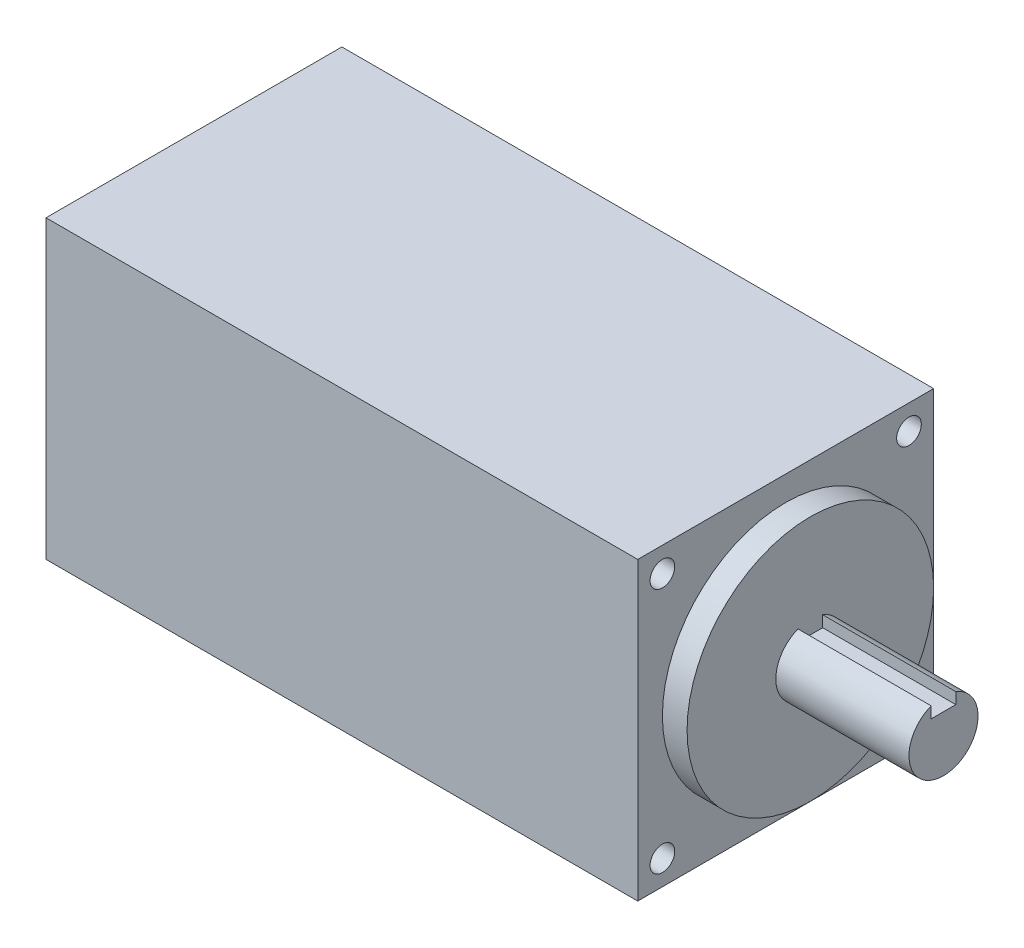
ISO-10303-21;
HEADER;
FILE_DESCRIPTION(('STEP AP214'),'2;1');
FILE_NAME('part.step','',(''),(''),'','','');
FILE_SCHEMA(('AUTOMOTIVE_DESIGN { 1 0 10303 214 1 1 1 1 }'));
ENDSEC;
DATA;
#1=APPLICATION_CONTEXT('core data for automotive mechanical design processes');
#2=APPLICATION_PROTOCOL_DEFINITION('international standard','automotive_design',2000,#1);
#3=PRODUCT_CONTEXT('',#1,'mechanical');
#4=PRODUCT('Part','Part','',(#3));
#5=PRODUCT_RELATED_PRODUCT_CATEGORY('part','',(#4));
#6=PRODUCT_DEFINITION_FORMATION('','',#4);
#7=PRODUCT_DEFINITION_CONTEXT('part definition',#1,'design');
#8=PRODUCT_DEFINITION('design','',#6,#7);
#9=PRODUCT_DEFINITION_SHAPE('','',#8);
#10=(LENGTH_UNIT() NAMED_UNIT(*) SI_UNIT(.MILLI.,.METRE.));
#11=(NAMED_UNIT(*) PLANE_ANGLE_UNIT() SI_UNIT($,.RADIAN.));
#12=(NAMED_UNIT(*) SI_UNIT($,.STERADIAN.) SOLID_ANGLE_UNIT());
#13=UNCERTAINTY_MEASURE_WITH_UNIT(LENGTH_MEASURE(1.E-05),#10,'distance_accuracy_value','');
#14=(GEOMETRIC_REPRESENTATION_CONTEXT(3) GLOBAL_UNCERTAINTY_ASSIGNED_CONTEXT((#13)) GLOBAL_UNIT_ASSIGNED_CONTEXT((#10,
#11,#12)) REPRESENTATION_CONTEXT('',''));
#15=CARTESIAN_POINT('',(0.,0.,0.));
#16=DIRECTION('',(0.,0.,1.));
#17=DIRECTION('',(1.,0.,0.));
#18=AXIS2_PLACEMENT_3D('',#15,#16,#17);
#19=CARTESIAN_POINT('',(-120.,-30.,-30.));
#20=DIRECTION('',(0.,0.,-1.));
#21=DIRECTION('',(-1.,0.,0.));
#22=AXIS2_PLACEMENT_3D('',#19,#20,#21);
#23=PLANE('',#22);
#24=DIRECTION('',(0.,1.,0.));
#25=VECTOR('',#24,1.);
#26=CARTESIAN_POINT('',(0.,-30.,-30.));
#27=LINE('',#26,#25);
#28=CARTESIAN_POINT('',(0.,-30.,-30.));
#29=VERTEX_POINT('',#28);
#30=CARTESIAN_POINT('',(0.,30.,-30.));
#31=VERTEX_POINT('',#30);
#32=EDGE_CURVE('E199',#29,#31,#27,.T.);
#33=ORIENTED_EDGE('',*,*,#32,.F.);
#34=DIRECTION('',(1.,0.,0.));
#35=VECTOR('',#34,1.);
#36=CARTESIAN_POINT('',(-120.,-30.,-30.));
#37=LINE('',#36,#35);
#38=CARTESIAN_POINT('',(-120.,-30.,-30.));
#39=VERTEX_POINT('',#38);
#40=EDGE_CURVE('E66',#39,#29,#37,.T.);
#41=ORIENTED_EDGE('',*,*,#40,.F.);
#42=DIRECTION('',(0.,1.,0.));
#43=VECTOR('',#42,1.);
#44=CARTESIAN_POINT('',(-120.,-30.,-30.));
#45=LINE('',#44,#43);
#46=CARTESIAN_POINT('',(-120.,30.,-30.));
#47=VERTEX_POINT('',#46);
#48=EDGE_CURVE('E203',#39,#47,#45,.T.);
#49=ORIENTED_EDGE('',*,*,#48,.T.);
#50=DIRECTION('',(1.,0.,0.));
#51=VECTOR('',#50,1.);
#52=CARTESIAN_POINT('',(-120.,30.,-30.));
#53=LINE('',#52,#51);
#54=EDGE_CURVE('E92',#47,#31,#53,.T.);
#55=ORIENTED_EDGE('',*,*,#54,.T.);
#56=EDGE_LOOP('',(#33,#41,#49,#55));
#57=FACE_BOUND('',#56,.T.);
#58=ADVANCED_FACE('F43',(#57),#23,.T.);
#59=CARTESIAN_POINT('',(-120.,-30.,30.));
#60=DIRECTION('',(0.,-1.,0.));
#61=DIRECTION('',(0.,0.,-1.));
#62=AXIS2_PLACEMENT_3D('',#59,#60,#61);
#63=PLANE('',#62);
#64=DIRECTION('',(0.,0.,-1.));
#65=VECTOR('',#64,1.);
#66=CARTESIAN_POINT('',(0.,-30.,30.));
#67=LINE('',#66,#65);
#68=CARTESIAN_POINT('',(0.,-30.,30.));
#69=VERTEX_POINT('',#68);
#70=EDGE_CURVE('E207',#69,#29,#67,.T.);
#71=ORIENTED_EDGE('',*,*,#70,.F.);
#72=DIRECTION('',(1.,0.,0.));
#73=VECTOR('',#72,1.);
#74=CARTESIAN_POINT('',(-120.,-30.,30.));
#75=LINE('',#74,#73);
#76=CARTESIAN_POINT('',(-120.,-30.,30.));
#77=VERTEX_POINT('',#76);
#78=EDGE_CURVE('E233',#77,#69,#75,.T.);
#79=ORIENTED_EDGE('',*,*,#78,.F.);
#80=DIRECTION('',(0.,0.,-1.));
#81=VECTOR('',#80,1.);
#82=CARTESIAN_POINT('',(-120.,-30.,30.));
#83=LINE('',#82,#81);
#84=EDGE_CURVE('E214',#77,#39,#83,.T.);
#85=ORIENTED_EDGE('',*,*,#84,.T.);
#86=ORIENTED_EDGE('',*,*,#40,.T.);
#87=EDGE_LOOP('',(#71,#79,#85,#86));
#88=FACE_BOUND('',#87,.T.);
#89=ADVANCED_FACE('F243',(#88),#63,.T.);
#90=CARTESIAN_POINT('',(-120.,-30.,30.));
#91=DIRECTION('',(0.,0.,1.));
#92=DIRECTION('',(1.,0.,0.));
#93=AXIS2_PLACEMENT_3D('',#90,#91,#92);
#94=PLANE('',#93);
#95=DIRECTION('',(0.,-1.,0.));
#96=VECTOR('',#95,1.);
#97=CARTESIAN_POINT('',(0.,-30.,30.));
#98=LINE('',#97,#96);
#99=CARTESIAN_POINT('',(0.,30.,30.));
#100=VERTEX_POINT('',#99);
#101=EDGE_CURVE('E224',#100,#69,#98,.T.);
#102=ORIENTED_EDGE('',*,*,#101,.F.);
#103=DIRECTION('',(1.,0.,0.));
#104=VECTOR('',#103,1.);
#105=CARTESIAN_POINT('',(-120.,30.,30.));
#106=LINE('',#105,#104);
#107=CARTESIAN_POINT('',(-120.,30.,30.));
#108=VERTEX_POINT('',#107);
#109=EDGE_CURVE('E236',#108,#100,#106,.T.);
#110=ORIENTED_EDGE('',*,*,#109,.F.);
#111=DIRECTION('',(0.,-1.,0.));
#112=VECTOR('',#111,1.);
#113=CARTESIAN_POINT('',(-120.,-30.,30.));
#114=LINE('',#113,#112);
#115=EDGE_CURVE('E210',#108,#77,#114,.T.);
#116=ORIENTED_EDGE('',*,*,#115,.T.);
#117=ORIENTED_EDGE('',*,*,#78,.T.);
#118=EDGE_LOOP('',(#102,#110,#116,#117));
#119=FACE_BOUND('',#118,.T.);
#120=ADVANCED_FACE('F247',(#119),#94,.T.);
#121=CARTESIAN_POINT('',(-120.,30.,30.));
#122=DIRECTION('',(0.,1.,0.));
#123=DIRECTION('',(0.,0.,1.));
#124=AXIS2_PLACEMENT_3D('',#121,#122,#123);
#125=PLANE('',#124);
#126=DIRECTION('',(0.,0.,1.));
#127=VECTOR('',#126,1.);
#128=CARTESIAN_POINT('',(0.,30.,30.));
#129=LINE('',#128,#127);
#130=EDGE_CURVE('E220',#31,#100,#129,.T.);
#131=ORIENTED_EDGE('',*,*,#130,.F.);
#132=ORIENTED_EDGE('',*,*,#54,.F.);
#133=DIRECTION('',(0.,0.,1.));
#134=VECTOR('',#133,1.);
#135=CARTESIAN_POINT('',(-120.,30.,30.));
#136=LINE('',#135,#134);
#137=EDGE_CURVE('E206',#47,#108,#136,.T.);
#138=ORIENTED_EDGE('',*,*,#137,.T.);
#139=ORIENTED_EDGE('',*,*,#109,.T.);
#140=EDGE_LOOP('',(#131,#132,#138,#139));
#141=FACE_BOUND('',#140,.T.);
#142=ADVANCED_FACE('F239',(#141),#125,.T.);
#143=CARTESIAN_POINT('',(-120.,0.,0.));
#144=DIRECTION('',(-1.,0.,0.));
#145=DIRECTION('',(0.,0.,1.));
#146=AXIS2_PLACEMENT_3D('',#143,#144,#145);
#147=PLANE('',#146);
#148=ORIENTED_EDGE('',*,*,#48,.F.);
#149=ORIENTED_EDGE('',*,*,#84,.F.);
#150=ORIENTED_EDGE('',*,*,#115,.F.);
#151=ORIENTED_EDGE('',*,*,#137,.F.);
#152=EDGE_LOOP('',(#148,#149,#150,#151));
#153=FACE_BOUND('',#152,.T.);
#154=ADVANCED_FACE('F249',(#153),#147,.T.);
#155=CARTESIAN_POINT('',(0.,0.,0.));
#156=DIRECTION('',(-1.,0.,0.));
#157=DIRECTION('',(0.,0.,1.));
#158=AXIS2_PLACEMENT_3D('',#155,#156,#157);
#159=PLANE('',#158);
#160=CARTESIAN_POINT('',(0.,0.,0.));
#161=DIRECTION('',(1.,0.,0.));
#162=DIRECTION('',(0.,0.,-1.));
#163=AXIS2_PLACEMENT_3D('',#160,#161,#162);
#164=CIRCLE('',#163,25.);
#165=CARTESIAN_POINT('',(0.,0.,-25.));
#166=VERTEX_POINT('',#165);
#167=EDGE_CURVE('E163',#166,#166,#164,.T.);
#168=ORIENTED_EDGE('',*,*,#167,.F.);
#169=EDGE_LOOP('',(#168));
#170=FACE_BOUND('',#169,.T.);
#171=CARTESIAN_POINT('',(0.,25.,-25.));
#172=DIRECTION('',(1.,0.,0.));
#173=DIRECTION('',(0.,0.,-1.));
#174=AXIS2_PLACEMENT_3D('',#171,#172,#173);
#175=CIRCLE('',#174,2.5);
#176=CARTESIAN_POINT('',(0.,25.,-27.5));
#177=VERTEX_POINT('',#176);
#178=EDGE_CURVE('E179',#177,#177,#175,.T.);
#179=ORIENTED_EDGE('',*,*,#178,.F.);
#180=EDGE_LOOP('',(#179));
#181=FACE_BOUND('',#180,.T.);
#182=CARTESIAN_POINT('',(0.,-25.,25.));
#183=DIRECTION('',(1.,0.,0.));
#184=DIRECTION('',(0.,0.,-1.));
#185=AXIS2_PLACEMENT_3D('',#182,#183,#184);
#186=CIRCLE('',#185,2.5);
#187=CARTESIAN_POINT('',(0.,-25.,22.5));
#188=VERTEX_POINT('',#187);
#189=EDGE_CURVE('E188',#188,#188,#186,.T.);
#190=ORIENTED_EDGE('',*,*,#189,.F.);
#191=EDGE_LOOP('',(#190));
#192=FACE_BOUND('',#191,.T.);
#193=CARTESIAN_POINT('',(0.,-25.,-25.));
#194=DIRECTION('',(1.,0.,0.));
#195=DIRECTION('',(0.,0.,-1.));
#196=AXIS2_PLACEMENT_3D('',#193,#194,#195);
#197=CIRCLE('',#196,2.5);
#198=CARTESIAN_POINT('',(0.,-25.,-27.5));
#199=VERTEX_POINT('',#198);
#200=EDGE_CURVE('E171',#199,#199,#197,.T.);
#201=ORIENTED_EDGE('',*,*,#200,.F.);
#202=EDGE_LOOP('',(#201));
#203=FACE_BOUND('',#202,.T.);
#204=CARTESIAN_POINT('',(0.,25.,25.));
#205=DIRECTION('',(1.,0.,0.));
#206=DIRECTION('',(0.,0.,-1.));
#207=AXIS2_PLACEMENT_3D('',#204,#205,#206);
#208=CIRCLE('',#207,2.5);
#209=CARTESIAN_POINT('',(0.,25.,22.5));
#210=VERTEX_POINT('',#209);
#211=EDGE_CURVE('E183',#210,#210,#208,.T.);
#212=ORIENTED_EDGE('',*,*,#211,.F.);
#213=EDGE_LOOP('',(#212));
#214=FACE_BOUND('',#213,.T.);
#215=ORIENTED_EDGE('',*,*,#32,.T.);
#216=ORIENTED_EDGE('',*,*,#130,.T.);
#217=ORIENTED_EDGE('',*,*,#101,.T.);
#218=ORIENTED_EDGE('',*,*,#70,.T.);
#219=EDGE_LOOP('',(#215,#216,#217,#218));
#220=FACE_BOUND('',#219,.T.);
#221=ADVANCED_FACE('F242',(#170,#181,#192,#203,#214,#220),#159,.F.);
#222=CARTESIAN_POINT('',(-20.,25.,25.));
#223=DIRECTION('',(1.,0.,0.));
#224=DIRECTION('',(0.,0.,-1.));
#225=AXIS2_PLACEMENT_3D('',#222,#223,#224);
#226=CYLINDRICAL_SURFACE('',#225,2.5);
#227=CARTESIAN_POINT('',(-20.,25.,25.));
#228=DIRECTION('',(1.,0.,0.));
#229=DIRECTION('',(0.,0.,-1.));
#230=AXIS2_PLACEMENT_3D('',#227,#228,#229);
#231=CIRCLE('',#230,2.5);
#232=CARTESIAN_POINT('',(-20.,25.,22.5));
#233=VERTEX_POINT('',#232);
#234=EDGE_CURVE('E195',#233,#233,#231,.T.);
#235=ORIENTED_EDGE('',*,*,#234,.F.);
#236=EDGE_LOOP('',(#235));
#237=FACE_BOUND('',#236,.T.);
#238=ORIENTED_EDGE('',*,*,#211,.T.);
#239=EDGE_LOOP('',(#238));
#240=FACE_BOUND('',#239,.T.);
#241=ADVANCED_FACE('F256',(#237,#240),#226,.F.);
#242=CARTESIAN_POINT('',(-20.,25.,25.));
#243=DIRECTION('',(1.,0.,0.));
#244=DIRECTION('',(0.,0.,-1.));
#245=AXIS2_PLACEMENT_3D('',#242,#243,#244);
#246=PLANE('',#245);
#247=ORIENTED_EDGE('',*,*,#234,.T.);
#248=EDGE_LOOP('',(#247));
#249=FACE_BOUND('',#248,.T.);
#250=ADVANCED_FACE('F291',(#249),#246,.T.);
#251=CARTESIAN_POINT('',(-20.,-25.,-25.));
#252=DIRECTION('',(1.,0.,0.));
#253=DIRECTION('',(0.,0.,-1.));
#254=AXIS2_PLACEMENT_3D('',#251,#252,#253);
#255=CYLINDRICAL_SURFACE('',#254,2.5);
#256=CARTESIAN_POINT('',(-20.,-25.,-25.));
#257=DIRECTION('',(1.,0.,0.));
#258=DIRECTION('',(0.,0.,-1.));
#259=AXIS2_PLACEMENT_3D('',#256,#257,#258);
#260=CIRCLE('',#259,2.5);
#261=CARTESIAN_POINT('',(-20.,-25.,-27.5));
#262=VERTEX_POINT('',#261);
#263=EDGE_CURVE('E167',#262,#262,#260,.T.);
#264=ORIENTED_EDGE('',*,*,#263,.F.);
#265=EDGE_LOOP('',(#264));
#266=FACE_BOUND('',#265,.T.);
#267=ORIENTED_EDGE('',*,*,#200,.T.);
#268=EDGE_LOOP('',(#267));
#269=FACE_BOUND('',#268,.T.);
#270=ADVANCED_FACE('F301',(#266,#269),#255,.F.);
#271=CARTESIAN_POINT('',(-20.,-25.,-25.));
#272=DIRECTION('',(1.,0.,0.));
#273=DIRECTION('',(0.,0.,-1.));
#274=AXIS2_PLACEMENT_3D('',#271,#272,#273);
#275=PLANE('',#274);
#276=ORIENTED_EDGE('',*,*,#263,.T.);
#277=EDGE_LOOP('',(#276));
#278=FACE_BOUND('',#277,.T.);
#279=ADVANCED_FACE('F312',(#278),#275,.T.);
#280=CARTESIAN_POINT('',(-20.,-25.,25.));
#281=DIRECTION('',(1.,0.,0.));
#282=DIRECTION('',(0.,0.,-1.));
#283=AXIS2_PLACEMENT_3D('',#280,#281,#282);
#284=CYLINDRICAL_SURFACE('',#283,2.5);
#285=CARTESIAN_POINT('',(-20.,-25.,25.));
#286=DIRECTION('',(1.,0.,0.));
#287=DIRECTION('',(0.,0.,-1.));
#288=AXIS2_PLACEMENT_3D('',#285,#286,#287);
#289=CIRCLE('',#288,2.5);
#290=CARTESIAN_POINT('',(-20.,-25.,22.5));
#291=VERTEX_POINT('',#290);
#292=EDGE_CURVE('E175',#291,#291,#289,.T.);
#293=ORIENTED_EDGE('',*,*,#292,.F.);
#294=EDGE_LOOP('',(#293));
#295=FACE_BOUND('',#294,.T.);
#296=ORIENTED_EDGE('',*,*,#189,.T.);
#297=EDGE_LOOP('',(#296));
#298=FACE_BOUND('',#297,.T.);
#299=ADVANCED_FACE('F323',(#295,#298),#284,.F.);
#300=CARTESIAN_POINT('',(-20.,-25.,25.));
#301=DIRECTION('',(1.,0.,0.));
#302=DIRECTION('',(0.,0.,-1.));
#303=AXIS2_PLACEMENT_3D('',#300,#301,#302);
#304=PLANE('',#303);
#305=ORIENTED_EDGE('',*,*,#292,.T.);
#306=EDGE_LOOP('',(#305));
#307=FACE_BOUND('',#306,.T.);
#308=ADVANCED_FACE('F334',(#307),#304,.T.);
#309=CARTESIAN_POINT('',(-20.,25.,-25.));
#310=DIRECTION('',(1.,0.,0.));
#311=DIRECTION('',(0.,0.,-1.));
#312=AXIS2_PLACEMENT_3D('',#309,#310,#311);
#313=CYLINDRICAL_SURFACE('',#312,2.5);
#314=CARTESIAN_POINT('',(-20.,25.,-25.));
#315=DIRECTION('',(1.,0.,0.));
#316=DIRECTION('',(0.,0.,-1.));
#317=AXIS2_PLACEMENT_3D('',#314,#315,#316);
#318=CIRCLE('',#317,2.5);
#319=CARTESIAN_POINT('',(-20.,25.,-27.5));
#320=VERTEX_POINT('',#319);
#321=EDGE_CURVE('E184',#320,#320,#318,.T.);
#322=ORIENTED_EDGE('',*,*,#321,.F.);
#323=EDGE_LOOP('',(#322));
#324=FACE_BOUND('',#323,.T.);
#325=ORIENTED_EDGE('',*,*,#178,.T.);
#326=EDGE_LOOP('',(#325));
#327=FACE_BOUND('',#326,.T.);
#328=ADVANCED_FACE('F345',(#324,#327),#313,.F.);
#329=CARTESIAN_POINT('',(-20.,25.,-25.));
#330=DIRECTION('',(1.,0.,0.));
#331=DIRECTION('',(0.,0.,-1.));
#332=AXIS2_PLACEMENT_3D('',#329,#330,#331);
#333=PLANE('',#332);
#334=ORIENTED_EDGE('',*,*,#321,.T.);
#335=EDGE_LOOP('',(#334));
#336=FACE_BOUND('',#335,.T.);
#337=ADVANCED_FACE('F356',(#336),#333,.T.);
#338=CARTESIAN_POINT('',(5.,0.,0.));
#339=DIRECTION('',(-1.,0.,0.));
#340=DIRECTION('',(0.,0.,1.));
#341=AXIS2_PLACEMENT_3D('',#338,#339,#340);
#342=CYLINDRICAL_SURFACE('',#341,25.);
#343=CARTESIAN_POINT('',(5.,0.,0.));
#344=DIRECTION('',(1.,0.,0.));
#345=DIRECTION('',(0.,0.,-1.));
#346=AXIS2_PLACEMENT_3D('',#343,#344,#345);
#347=CIRCLE('',#346,25.);
#348=CARTESIAN_POINT('',(5.,0.,-25.));
#349=VERTEX_POINT('',#348);
#350=EDGE_CURVE('E160',#349,#349,#347,.T.);
#351=ORIENTED_EDGE('',*,*,#350,.F.);
#352=EDGE_LOOP('',(#351));
#353=FACE_BOUND('',#352,.T.);
#354=ORIENTED_EDGE('',*,*,#167,.T.);
#355=EDGE_LOOP('',(#354));
#356=FACE_BOUND('',#355,.T.);
#357=ADVANCED_FACE('F367',(#353,#356),#342,.T.);
#358=CARTESIAN_POINT('',(5.,0.,0.));
#359=DIRECTION('',(1.,0.,0.));
#360=DIRECTION('',(0.,0.,-1.));
#361=AXIS2_PLACEMENT_3D('',#358,#359,#360);
#362=PLANE('',#361);
#363=CARTESIAN_POINT('',(5.,0.,0.));
#364=DIRECTION('',(1.,0.,0.));
#365=DIRECTION('',(0.,0.,-1.));
#366=AXIS2_PLACEMENT_3D('',#363,#364,#365);
#367=CIRCLE('',#366,7.);
#368=CARTESIAN_POINT('',(5.,6.53834841531101,2.5));
#369=VERTEX_POINT('',#368);
#370=CARTESIAN_POINT('',(5.,6.53834841531101,-2.5));
#371=VERTEX_POINT('',#370);
#372=EDGE_CURVE('E51',#369,#371,#367,.T.);
#373=ORIENTED_EDGE('',*,*,#372,.F.);
#374=DIRECTION('',(0.,-1.,0.));
#375=VECTOR('',#374,1.);
#376=CARTESIAN_POINT('',(5.,4.25116414420755,2.5));
#377=LINE('',#376,#375);
#378=CARTESIAN_POINT('',(5.,4.25116414420755,2.5));
#379=VERTEX_POINT('',#378);
#380=EDGE_CURVE('E116',#369,#379,#377,.T.);
#381=ORIENTED_EDGE('',*,*,#380,.T.);
#382=DIRECTION('',(0.,0.,-1.));
#383=VECTOR('',#382,1.);
#384=CARTESIAN_POINT('',(5.,4.25116414420755,2.5));
#385=LINE('',#384,#383);
#386=CARTESIAN_POINT('',(5.,4.25116414420755,-2.5));
#387=VERTEX_POINT('',#386);
#388=EDGE_CURVE('E122',#379,#387,#385,.T.);
#389=ORIENTED_EDGE('',*,*,#388,.T.);
#390=DIRECTION('',(0.,1.,0.));
#391=VECTOR('',#390,1.);
#392=CARTESIAN_POINT('',(5.,4.25116414420755,-2.5));
#393=LINE('',#392,#391);
#394=EDGE_CURVE('E125',#387,#371,#393,.T.);
#395=ORIENTED_EDGE('',*,*,#394,.T.);
#396=EDGE_LOOP('',(#373,#381,#389,#395));
#397=FACE_BOUND('',#396,.T.);
#398=ORIENTED_EDGE('',*,*,#350,.T.);
#399=EDGE_LOOP('',(#398));
#400=FACE_BOUND('',#399,.T.);
#401=ADVANCED_FACE('F118',(#397,#400),#362,.T.);
#402=CARTESIAN_POINT('',(32.,0.,0.));
#403=DIRECTION('',(-1.,0.,0.));
#404=DIRECTION('',(0.,0.,1.));
#405=AXIS2_PLACEMENT_3D('',#402,#403,#404);
#406=CYLINDRICAL_SURFACE('',#405,7.);
#407=ORIENTED_EDGE('',*,*,#372,.T.);
#408=DIRECTION('',(-1.,0.,0.));
#409=VECTOR('',#408,1.);
#410=CARTESIAN_POINT('',(32.,6.53834841531101,-2.5));
#411=LINE('',#410,#409);
#412=CARTESIAN_POINT('',(32.,6.53834841531101,-2.5));
#413=VERTEX_POINT('',#412);
#414=EDGE_CURVE('E152',#371,#413,#411,.F.);
#415=ORIENTED_EDGE('',*,*,#414,.T.);
#416=CARTESIAN_POINT('',(32.,0.,0.));
#417=DIRECTION('',(1.,0.,0.));
#418=DIRECTION('',(0.,0.,-1.));
#419=AXIS2_PLACEMENT_3D('',#416,#417,#418);
#420=CIRCLE('',#419,7.);
#421=CARTESIAN_POINT('',(32.,6.53834841531101,2.5));
#422=VERTEX_POINT('',#421);
#423=EDGE_CURVE('E156',#422,#413,#420,.T.);
#424=ORIENTED_EDGE('',*,*,#423,.F.);
#425=DIRECTION('',(-1.,0.,0.));
#426=VECTOR('',#425,1.);
#427=CARTESIAN_POINT('',(32.,6.53834841531101,2.5));
#428=LINE('',#427,#426);
#429=EDGE_CURVE('E57',#422,#369,#428,.T.);
#430=ORIENTED_EDGE('',*,*,#429,.T.);
#431=EDGE_LOOP('',(#407,#415,#424,#430));
#432=FACE_BOUND('',#431,.T.);
#433=ADVANCED_FACE('F395',(#432),#406,.T.);
#434=CARTESIAN_POINT('',(32.,0.,0.));
#435=DIRECTION('',(1.,0.,0.));
#436=DIRECTION('',(0.,0.,-1.));
#437=AXIS2_PLACEMENT_3D('',#434,#435,#436);
#438=PLANE('',#437);
#439=DIRECTION('',(0.,1.,0.));
#440=VECTOR('',#439,1.);
#441=CARTESIAN_POINT('',(32.,4.25116414420755,-2.5));
#442=LINE('',#441,#440);
#443=CARTESIAN_POINT('',(32.,4.25116414420755,-2.5));
#444=VERTEX_POINT('',#443);
#445=EDGE_CURVE('E142',#444,#413,#442,.T.);
#446=ORIENTED_EDGE('',*,*,#445,.F.);
#447=DIRECTION('',(0.,0.,-1.));
#448=VECTOR('',#447,1.);
#449=CARTESIAN_POINT('',(32.,4.25116414420755,2.5));
#450=LINE('',#449,#448);
#451=CARTESIAN_POINT('',(32.,4.25116414420755,2.5));
#452=VERTEX_POINT('',#451);
#453=EDGE_CURVE('E145',#452,#444,#450,.T.);
#454=ORIENTED_EDGE('',*,*,#453,.F.);
#455=DIRECTION('',(0.,-1.,0.));
#456=VECTOR('',#455,1.);
#457=CARTESIAN_POINT('',(32.,0.,2.5));
#458=LINE('',#457,#456);
#459=EDGE_CURVE('E11',#422,#452,#458,.T.);
#460=ORIENTED_EDGE('',*,*,#459,.F.);
#461=ORIENTED_EDGE('',*,*,#423,.T.);
#462=EDGE_LOOP('',(#446,#454,#460,#461));
#463=FACE_BOUND('',#462,.T.);
#464=ADVANCED_FACE('F406',(#463),#438,.T.);
#465=CARTESIAN_POINT('',(5.,4.25116414420755,-2.5));
#466=DIRECTION('',(0.,0.,-1.));
#467=DIRECTION('',(0.,1.,0.));
#468=AXIS2_PLACEMENT_3D('',#465,#466,#467);
#469=PLANE('',#468);
#470=ORIENTED_EDGE('',*,*,#394,.F.);
#471=DIRECTION('',(1.,0.,0.));
#472=VECTOR('',#471,1.);
#473=CARTESIAN_POINT('',(5.,4.25116414420755,-2.5));
#474=LINE('',#473,#472);
#475=EDGE_CURVE('E134',#387,#444,#474,.T.);
#476=ORIENTED_EDGE('',*,*,#475,.T.);
#477=ORIENTED_EDGE('',*,*,#445,.T.);
#478=ORIENTED_EDGE('',*,*,#414,.F.);
#479=EDGE_LOOP('',(#470,#476,#477,#478));
#480=FACE_BOUND('',#479,.T.);
#481=ADVANCED_FACE('F417',(#480),#469,.F.);
#482=CARTESIAN_POINT('',(5.,4.25116414420755,2.5));
#483=DIRECTION('',(0.,0.,1.));
#484=DIRECTION('',(1.,0.,0.));
#485=AXIS2_PLACEMENT_3D('',#482,#483,#484);
#486=PLANE('',#485);
#487=ORIENTED_EDGE('',*,*,#459,.T.);
#488=DIRECTION('',(1.,0.,0.));
#489=VECTOR('',#488,1.);
#490=CARTESIAN_POINT('',(5.,4.25116414420755,2.5));
#491=LINE('',#490,#489);
#492=EDGE_CURVE('E128',#379,#452,#491,.T.);
#493=ORIENTED_EDGE('',*,*,#492,.F.);
#494=ORIENTED_EDGE('',*,*,#380,.F.);
#495=ORIENTED_EDGE('',*,*,#429,.F.);
#496=EDGE_LOOP('',(#487,#493,#494,#495));
#497=FACE_BOUND('',#496,.T.);
#498=ADVANCED_FACE('F129',(#497),#486,.F.);
#499=CARTESIAN_POINT('',(5.,4.25116414420755,2.5));
#500=DIRECTION('',(0.,-1.,0.));
#501=DIRECTION('',(0.,0.,-1.));
#502=AXIS2_PLACEMENT_3D('',#499,#500,#501);
#503=PLANE('',#502);
#504=ORIENTED_EDGE('',*,*,#453,.T.);
#505=ORIENTED_EDGE('',*,*,#475,.F.);
#506=ORIENTED_EDGE('',*,*,#388,.F.);
#507=ORIENTED_EDGE('',*,*,#492,.T.);
#508=EDGE_LOOP('',(#504,#505,#506,#507));
#509=FACE_BOUND('',#508,.T.);
#510=ADVANCED_FACE('F136',(#509),#503,.F.);
#511=CLOSED_SHELL('',(#58,#89,#120,#142,#154,#221,#241,#250,#270,#279,#299,#308,#328,#337,#357,
#401,#433,#464,#481,#498,#510));
#512=MANIFOLD_SOLID_BREP('B2',#511);
#513=ADVANCED_BREP_SHAPE_REPRESENTATION('',(#18,#512),#14);
#514=SHAPE_DEFINITION_REPRESENTATION(#9,#513);
ENDSEC;
END-ISO-10303-21;
